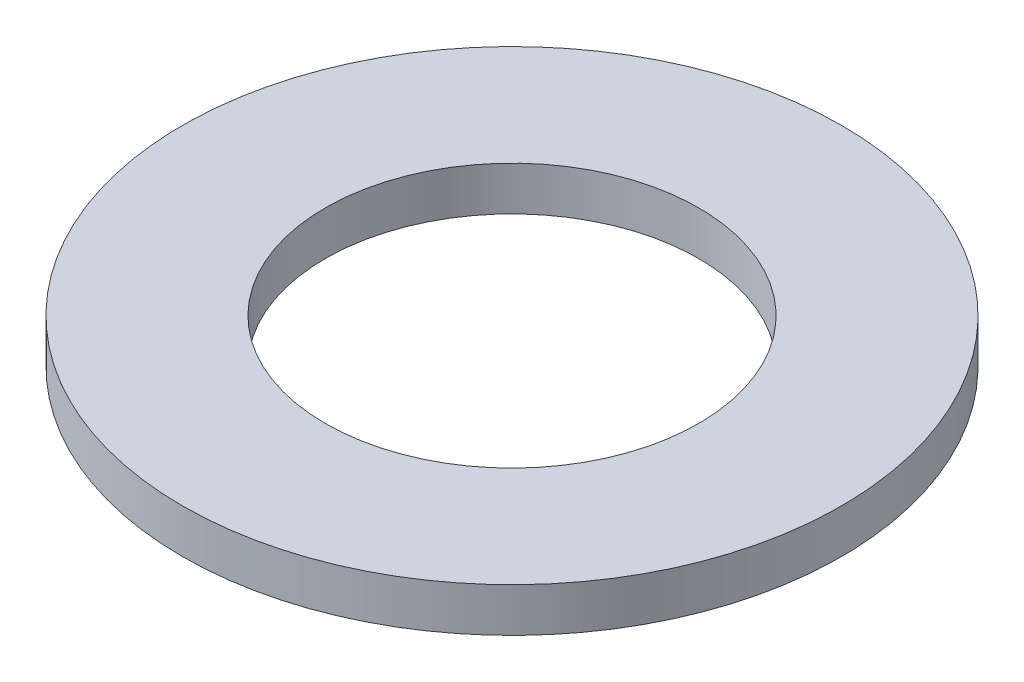
ISO-10303-21;
HEADER;
FILE_DESCRIPTION(('STEP AP214'),'2;1');
FILE_NAME('part.step','',(''),(''),'','','');
FILE_SCHEMA(('AUTOMOTIVE_DESIGN { 1 0 10303 214 1 1 1 1 }'));
ENDSEC;
DATA;
#1=APPLICATION_CONTEXT('core data for automotive mechanical design processes');
#2=APPLICATION_PROTOCOL_DEFINITION('international standard','automotive_design',2000,#1);
#3=PRODUCT_CONTEXT('',#1,'mechanical');
#4=PRODUCT('Part','Part','',(#3));
#5=PRODUCT_RELATED_PRODUCT_CATEGORY('part','',(#4));
#6=PRODUCT_DEFINITION_FORMATION('','',#4);
#7=PRODUCT_DEFINITION_CONTEXT('part definition',#1,'design');
#8=PRODUCT_DEFINITION('design','',#6,#7);
#9=PRODUCT_DEFINITION_SHAPE('','',#8);
#10=(LENGTH_UNIT() NAMED_UNIT(*) SI_UNIT(.MILLI.,.METRE.));
#11=(NAMED_UNIT(*) PLANE_ANGLE_UNIT() SI_UNIT($,.RADIAN.));
#12=(NAMED_UNIT(*) SI_UNIT($,.STERADIAN.) SOLID_ANGLE_UNIT());
#13=UNCERTAINTY_MEASURE_WITH_UNIT(LENGTH_MEASURE(1.E-05),#10,'distance_accuracy_value','');
#14=(GEOMETRIC_REPRESENTATION_CONTEXT(3) GLOBAL_UNCERTAINTY_ASSIGNED_CONTEXT((#13)) GLOBAL_UNIT_ASSIGNED_CONTEXT((#10,
#11,#12)) REPRESENTATION_CONTEXT('',''));
#15=CARTESIAN_POINT('',(0.,0.,0.));
#16=DIRECTION('',(0.,0.,1.));
#17=DIRECTION('',(1.,0.,0.));
#18=AXIS2_PLACEMENT_3D('',#15,#16,#17);
#19=CARTESIAN_POINT('',(0.,1.,0.));
#20=DIRECTION('',(0.,1.,0.));
#21=DIRECTION('',(0.,0.,1.));
#22=AXIS2_PLACEMENT_3D('',#19,#20,#21);
#23=PLANE('',#22);
#24=CARTESIAN_POINT('',(0.,1.,0.));
#25=DIRECTION('',(0.,1.,0.));
#26=DIRECTION('',(0.,0.,1.));
#27=AXIS2_PLACEMENT_3D('',#24,#25,#26);
#28=CIRCLE('',#27,7.5);
#29=CARTESIAN_POINT('',(0.,1.,7.5));
#30=VERTEX_POINT('',#29);
#31=EDGE_CURVE('E10',#30,#30,#28,.T.);
#32=ORIENTED_EDGE('',*,*,#31,.T.);
#33=EDGE_LOOP('',(#32));
#34=FACE_BOUND('',#33,.T.);
#35=CARTESIAN_POINT('',(0.,1.,0.));
#36=DIRECTION('',(0.,1.,0.));
#37=DIRECTION('',(0.,0.,1.));
#38=AXIS2_PLACEMENT_3D('',#35,#36,#37);
#39=CIRCLE('',#38,4.25);
#40=CARTESIAN_POINT('',(0.,1.,4.25));
#41=VERTEX_POINT('',#40);
#42=EDGE_CURVE('E46',#41,#41,#39,.T.);
#43=ORIENTED_EDGE('',*,*,#42,.F.);
#44=EDGE_LOOP('',(#43));
#45=FACE_BOUND('',#44,.T.);
#46=ADVANCED_FACE('F35',(#34,#45),#23,.T.);
#47=CARTESIAN_POINT('',(0.,0.,0.));
#48=DIRECTION('',(0.,1.,0.));
#49=DIRECTION('',(0.,0.,1.));
#50=AXIS2_PLACEMENT_3D('',#47,#48,#49);
#51=PLANE('',#50);
#52=CARTESIAN_POINT('',(0.,0.,0.));
#53=DIRECTION('',(0.,1.,0.));
#54=DIRECTION('',(0.,0.,1.));
#55=AXIS2_PLACEMENT_3D('',#52,#53,#54);
#56=CIRCLE('',#55,7.5);
#57=CARTESIAN_POINT('',(0.,0.,7.5));
#58=VERTEX_POINT('',#57);
#59=EDGE_CURVE('E39',#58,#58,#56,.T.);
#60=ORIENTED_EDGE('',*,*,#59,.F.);
#61=EDGE_LOOP('',(#60));
#62=FACE_BOUND('',#61,.T.);
#63=CARTESIAN_POINT('',(0.,0.,0.));
#64=DIRECTION('',(0.,1.,0.));
#65=DIRECTION('',(0.,0.,1.));
#66=AXIS2_PLACEMENT_3D('',#63,#64,#65);
#67=CIRCLE('',#66,4.25);
#68=CARTESIAN_POINT('',(0.,0.,4.25));
#69=VERTEX_POINT('',#68);
#70=EDGE_CURVE('E48',#69,#69,#67,.T.);
#71=ORIENTED_EDGE('',*,*,#70,.T.);
#72=EDGE_LOOP('',(#71));
#73=FACE_BOUND('',#72,.T.);
#74=ADVANCED_FACE('F58',(#62,#73),#51,.F.);
#75=CARTESIAN_POINT('',(0.,1.,0.));
#76=DIRECTION('',(0.,-1.,0.));
#77=DIRECTION('',(0.,0.,-1.));
#78=AXIS2_PLACEMENT_3D('',#75,#76,#77);
#79=CYLINDRICAL_SURFACE('',#78,7.5);
#80=ORIENTED_EDGE('',*,*,#31,.F.);
#81=EDGE_LOOP('',(#80));
#82=FACE_BOUND('',#81,.T.);
#83=ORIENTED_EDGE('',*,*,#59,.T.);
#84=EDGE_LOOP('',(#83));
#85=FACE_BOUND('',#84,.T.);
#86=ADVANCED_FACE('F37',(#82,#85),#79,.T.);
#87=CARTESIAN_POINT('',(0.,1.,0.));
#88=DIRECTION('',(0.,-1.,0.));
#89=DIRECTION('',(0.,0.,-1.));
#90=AXIS2_PLACEMENT_3D('',#87,#88,#89);
#91=CYLINDRICAL_SURFACE('',#90,4.25);
#92=ORIENTED_EDGE('',*,*,#42,.T.);
#93=EDGE_LOOP('',(#92));
#94=FACE_BOUND('',#93,.T.);
#95=ORIENTED_EDGE('',*,*,#70,.F.);
#96=EDGE_LOOP('',(#95));
#97=FACE_BOUND('',#96,.T.);
#98=ADVANCED_FACE('F54',(#94,#97),#91,.F.);
#99=CLOSED_SHELL('',(#46,#74,#86,#98));
#100=MANIFOLD_SOLID_BREP('B2',#99);
#101=ADVANCED_BREP_SHAPE_REPRESENTATION('',(#18,#100),#14);
#102=SHAPE_DEFINITION_REPRESENTATION(#9,#101);
ENDSEC;
END-ISO-10303-21;
